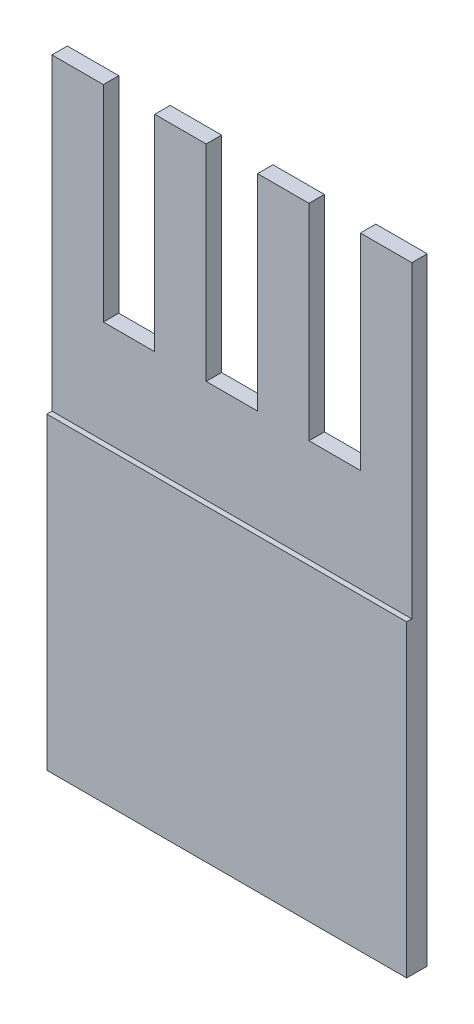
ISO-10303-21;
HEADER;
FILE_DESCRIPTION(('STEP AP214'),'2;1');
FILE_NAME('part.step','',(''),(''),'','','');
FILE_SCHEMA(('AUTOMOTIVE_DESIGN { 1 0 10303 214 1 1 1 1 }'));
ENDSEC;
DATA;
#1=APPLICATION_CONTEXT('core data for automotive mechanical design processes');
#2=APPLICATION_PROTOCOL_DEFINITION('international standard','automotive_design',2000,#1);
#3=PRODUCT_CONTEXT('',#1,'mechanical');
#4=PRODUCT('Part','Part','',(#3));
#5=PRODUCT_RELATED_PRODUCT_CATEGORY('part','',(#4));
#6=PRODUCT_DEFINITION_FORMATION('','',#4);
#7=PRODUCT_DEFINITION_CONTEXT('part definition',#1,'design');
#8=PRODUCT_DEFINITION('design','',#6,#7);
#9=PRODUCT_DEFINITION_SHAPE('','',#8);
#10=(LENGTH_UNIT() NAMED_UNIT(*) SI_UNIT(.MILLI.,.METRE.));
#11=(NAMED_UNIT(*) PLANE_ANGLE_UNIT() SI_UNIT($,.RADIAN.));
#12=(NAMED_UNIT(*) SI_UNIT($,.STERADIAN.) SOLID_ANGLE_UNIT());
#13=UNCERTAINTY_MEASURE_WITH_UNIT(LENGTH_MEASURE(1.E-05),#10,'distance_accuracy_value','');
#14=(GEOMETRIC_REPRESENTATION_CONTEXT(3) GLOBAL_UNCERTAINTY_ASSIGNED_CONTEXT((#13)) GLOBAL_UNIT_ASSIGNED_CONTEXT((#10,
#11,#12)) REPRESENTATION_CONTEXT('',''));
#15=CARTESIAN_POINT('',(0.,0.,0.));
#16=DIRECTION('',(0.,0.,1.));
#17=DIRECTION('',(1.,0.,0.));
#18=AXIS2_PLACEMENT_3D('',#15,#16,#17);
#19=CARTESIAN_POINT('',(0.,0.,2.));
#20=DIRECTION('',(0.,1.,0.));
#21=DIRECTION('',(0.,0.,1.));
#22=AXIS2_PLACEMENT_3D('',#19,#20,#21);
#23=PLANE('',#22);
#24=DIRECTION('',(1.,0.,0.));
#25=VECTOR('',#24,1.);
#26=CARTESIAN_POINT('',(0.,0.,1.5));
#27=LINE('',#26,#25);
#28=CARTESIAN_POINT('',(-17.5,0.,1.5));
#29=VERTEX_POINT('',#28);
#30=CARTESIAN_POINT('',(17.5,0.,1.5));
#31=VERTEX_POINT('',#30);
#32=EDGE_CURVE('E49',#29,#31,#27,.T.);
#33=ORIENTED_EDGE('',*,*,#32,.F.);
#34=DIRECTION('',(0.,0.,-1.));
#35=VECTOR('',#34,1.);
#36=CARTESIAN_POINT('',(-17.5,0.,2.));
#37=LINE('',#36,#35);
#38=CARTESIAN_POINT('',(-17.5,0.,2.));
#39=VERTEX_POINT('',#38);
#40=EDGE_CURVE('E11',#39,#29,#37,.T.);
#41=ORIENTED_EDGE('',*,*,#40,.F.);
#42=DIRECTION('',(1.,0.,0.));
#43=VECTOR('',#42,1.);
#44=CARTESIAN_POINT('',(0.,0.,2.));
#45=LINE('',#44,#43);
#46=CARTESIAN_POINT('',(17.5,0.,2.));
#47=VERTEX_POINT('',#46);
#48=EDGE_CURVE('E160',#39,#47,#45,.T.);
#49=ORIENTED_EDGE('',*,*,#48,.T.);
#50=DIRECTION('',(0.,0.,-1.));
#51=VECTOR('',#50,1.);
#52=CARTESIAN_POINT('',(17.5,0.,2.));
#53=LINE('',#52,#51);
#54=EDGE_CURVE('E56',#47,#31,#53,.T.);
#55=ORIENTED_EDGE('',*,*,#54,.T.);
#56=EDGE_LOOP('',(#33,#41,#49,#55));
#57=FACE_BOUND('',#56,.T.);
#58=ADVANCED_FACE('F35',(#57),#23,.T.);
#59=CARTESIAN_POINT('',(-17.5,0.,2.));
#60=DIRECTION('',(1.,0.,0.));
#61=DIRECTION('',(0.,0.,-1.));
#62=AXIS2_PLACEMENT_3D('',#59,#60,#61);
#63=PLANE('',#62);
#64=DIRECTION('',(0.,-1.,0.));
#65=VECTOR('',#64,1.);
#66=CARTESIAN_POINT('',(-17.5,0.,0.));
#67=LINE('',#66,#65);
#68=CARTESIAN_POINT('',(-17.5,30.,0.));
#69=VERTEX_POINT('',#68);
#70=CARTESIAN_POINT('',(-17.5,-30.,0.));
#71=VERTEX_POINT('',#70);
#72=EDGE_CURVE('E280',#69,#71,#67,.T.);
#73=ORIENTED_EDGE('',*,*,#72,.T.);
#74=DIRECTION('',(0.,0.,-1.));
#75=VECTOR('',#74,1.);
#76=CARTESIAN_POINT('',(-17.5,-30.,2.));
#77=LINE('',#76,#75);
#78=CARTESIAN_POINT('',(-17.5,-30.,2.));
#79=VERTEX_POINT('',#78);
#80=EDGE_CURVE('E42',#79,#71,#77,.T.);
#81=ORIENTED_EDGE('',*,*,#80,.F.);
#82=DIRECTION('',(0.,-1.,0.));
#83=VECTOR('',#82,1.);
#84=CARTESIAN_POINT('',(-17.5,0.,2.));
#85=LINE('',#84,#83);
#86=EDGE_CURVE('E282',#39,#79,#85,.T.);
#87=ORIENTED_EDGE('',*,*,#86,.F.);
#88=ORIENTED_EDGE('',*,*,#40,.T.);
#89=DIRECTION('',(0.,-1.,0.));
#90=VECTOR('',#89,1.);
#91=CARTESIAN_POINT('',(-17.5,0.,1.5));
#92=LINE('',#91,#90);
#93=CARTESIAN_POINT('',(-17.5,30.,1.5));
#94=VERTEX_POINT('',#93);
#95=EDGE_CURVE('E170',#94,#29,#92,.T.);
#96=ORIENTED_EDGE('',*,*,#95,.F.);
#97=DIRECTION('',(0.,0.,-1.));
#98=VECTOR('',#97,1.);
#99=CARTESIAN_POINT('',(-17.5,30.,1.5));
#100=LINE('',#99,#98);
#101=EDGE_CURVE('E213',#94,#69,#100,.T.);
#102=ORIENTED_EDGE('',*,*,#101,.T.);
#103=EDGE_LOOP('',(#73,#81,#87,#88,#96,#102));
#104=FACE_BOUND('',#103,.T.);
#105=ADVANCED_FACE('F301',(#104),#63,.F.);
#106=CARTESIAN_POINT('',(0.,-30.,2.));
#107=DIRECTION('',(0.,-1.,0.));
#108=DIRECTION('',(0.,0.,-1.));
#109=AXIS2_PLACEMENT_3D('',#106,#107,#108);
#110=PLANE('',#109);
#111=DIRECTION('',(-1.,0.,0.));
#112=VECTOR('',#111,1.);
#113=CARTESIAN_POINT('',(0.,-30.,0.));
#114=LINE('',#113,#112);
#115=CARTESIAN_POINT('',(17.5,-30.,0.));
#116=VERTEX_POINT('',#115);
#117=EDGE_CURVE('E291',#116,#71,#114,.T.);
#118=ORIENTED_EDGE('',*,*,#117,.F.);
#119=DIRECTION('',(0.,0.,-1.));
#120=VECTOR('',#119,1.);
#121=CARTESIAN_POINT('',(17.5,-30.,2.));
#122=LINE('',#121,#120);
#123=CARTESIAN_POINT('',(17.5,-30.,2.));
#124=VERTEX_POINT('',#123);
#125=EDGE_CURVE('E70',#124,#116,#122,.T.);
#126=ORIENTED_EDGE('',*,*,#125,.F.);
#127=DIRECTION('',(-1.,0.,0.));
#128=VECTOR('',#127,1.);
#129=CARTESIAN_POINT('',(0.,-30.,2.));
#130=LINE('',#129,#128);
#131=EDGE_CURVE('E285',#124,#79,#130,.T.);
#132=ORIENTED_EDGE('',*,*,#131,.T.);
#133=ORIENTED_EDGE('',*,*,#80,.T.);
#134=EDGE_LOOP('',(#118,#126,#132,#133));
#135=FACE_BOUND('',#134,.T.);
#136=ADVANCED_FACE('F298',(#135),#110,.T.);
#137=CARTESIAN_POINT('',(17.5,0.,2.));
#138=DIRECTION('',(1.,0.,0.));
#139=DIRECTION('',(0.,0.,-1.));
#140=AXIS2_PLACEMENT_3D('',#137,#138,#139);
#141=PLANE('',#140);
#142=DIRECTION('',(0.,-1.,0.));
#143=VECTOR('',#142,1.);
#144=CARTESIAN_POINT('',(17.5,0.,0.));
#145=LINE('',#144,#143);
#146=CARTESIAN_POINT('',(17.5,30.,0.));
#147=VERTEX_POINT('',#146);
#148=EDGE_CURVE('E283',#147,#116,#145,.T.);
#149=ORIENTED_EDGE('',*,*,#148,.F.);
#150=DIRECTION('',(0.,0.,-1.));
#151=VECTOR('',#150,1.);
#152=CARTESIAN_POINT('',(17.5,30.,1.5));
#153=LINE('',#152,#151);
#154=CARTESIAN_POINT('',(17.5,30.,1.5));
#155=VERTEX_POINT('',#154);
#156=EDGE_CURVE('E174',#155,#147,#153,.T.);
#157=ORIENTED_EDGE('',*,*,#156,.F.);
#158=DIRECTION('',(0.,-1.,0.));
#159=VECTOR('',#158,1.);
#160=CARTESIAN_POINT('',(17.5,0.,1.5));
#161=LINE('',#160,#159);
#162=EDGE_CURVE('E168',#155,#31,#161,.T.);
#163=ORIENTED_EDGE('',*,*,#162,.T.);
#164=ORIENTED_EDGE('',*,*,#54,.F.);
#165=DIRECTION('',(0.,-1.,0.));
#166=VECTOR('',#165,1.);
#167=CARTESIAN_POINT('',(17.5,0.,2.));
#168=LINE('',#167,#166);
#169=EDGE_CURVE('E162',#47,#124,#168,.T.);
#170=ORIENTED_EDGE('',*,*,#169,.T.);
#171=ORIENTED_EDGE('',*,*,#125,.T.);
#172=EDGE_LOOP('',(#149,#157,#163,#164,#170,#171));
#173=FACE_BOUND('',#172,.T.);
#174=ADVANCED_FACE('F172',(#173),#141,.T.);
#175=CARTESIAN_POINT('',(0.,0.,2.));
#176=DIRECTION('',(0.,0.,1.));
#177=DIRECTION('',(1.,0.,0.));
#178=AXIS2_PLACEMENT_3D('',#175,#176,#177);
#179=PLANE('',#178);
#180=ORIENTED_EDGE('',*,*,#48,.F.);
#181=ORIENTED_EDGE('',*,*,#86,.T.);
#182=ORIENTED_EDGE('',*,*,#131,.F.);
#183=ORIENTED_EDGE('',*,*,#169,.F.);
#184=EDGE_LOOP('',(#180,#181,#182,#183));
#185=FACE_BOUND('',#184,.T.);
#186=ADVANCED_FACE('F360',(#185),#179,.T.);
#187=CARTESIAN_POINT('',(0.,0.,0.));
#188=DIRECTION('',(0.,0.,1.));
#189=DIRECTION('',(1.,0.,0.));
#190=AXIS2_PLACEMENT_3D('',#187,#188,#189);
#191=PLANE('',#190);
#192=ORIENTED_EDGE('',*,*,#72,.F.);
#193=DIRECTION('',(-1.,0.,0.));
#194=VECTOR('',#193,1.);
#195=CARTESIAN_POINT('',(0.,30.,0.));
#196=LINE('',#195,#194);
#197=CARTESIAN_POINT('',(-12.5,30.,0.));
#198=VERTEX_POINT('',#197);
#199=EDGE_CURVE('E249',#198,#69,#196,.T.);
#200=ORIENTED_EDGE('',*,*,#199,.F.);
#201=DIRECTION('',(0.,-1.,0.));
#202=VECTOR('',#201,1.);
#203=CARTESIAN_POINT('',(-12.5,0.,0.));
#204=LINE('',#203,#202);
#205=CARTESIAN_POINT('',(-12.5,10.,0.));
#206=VERTEX_POINT('',#205);
#207=EDGE_CURVE('E246',#198,#206,#204,.T.);
#208=ORIENTED_EDGE('',*,*,#207,.T.);
#209=DIRECTION('',(1.,0.,0.));
#210=VECTOR('',#209,1.);
#211=CARTESIAN_POINT('',(0.,10.,0.));
#212=LINE('',#211,#210);
#213=CARTESIAN_POINT('',(-7.5,10.,0.));
#214=VERTEX_POINT('',#213);
#215=EDGE_CURVE('E243',#206,#214,#212,.T.);
#216=ORIENTED_EDGE('',*,*,#215,.T.);
#217=DIRECTION('',(0.,-1.,0.));
#218=VECTOR('',#217,1.);
#219=CARTESIAN_POINT('',(-7.5,0.,0.));
#220=LINE('',#219,#218);
#221=CARTESIAN_POINT('',(-7.5,30.,0.));
#222=VERTEX_POINT('',#221);
#223=EDGE_CURVE('E240',#222,#214,#220,.T.);
#224=ORIENTED_EDGE('',*,*,#223,.F.);
#225=DIRECTION('',(1.,0.,0.));
#226=VECTOR('',#225,1.);
#227=CARTESIAN_POINT('',(0.,30.,0.));
#228=LINE('',#227,#226);
#229=CARTESIAN_POINT('',(-2.5,30.,0.));
#230=VERTEX_POINT('',#229);
#231=EDGE_CURVE('E237',#222,#230,#228,.T.);
#232=ORIENTED_EDGE('',*,*,#231,.T.);
#233=DIRECTION('',(0.,-1.,0.));
#234=VECTOR('',#233,1.);
#235=CARTESIAN_POINT('',(-2.5,0.,0.));
#236=LINE('',#235,#234);
#237=CARTESIAN_POINT('',(-2.5,10.,0.));
#238=VERTEX_POINT('',#237);
#239=EDGE_CURVE('E234',#230,#238,#236,.T.);
#240=ORIENTED_EDGE('',*,*,#239,.T.);
#241=DIRECTION('',(1.,0.,0.));
#242=VECTOR('',#241,1.);
#243=CARTESIAN_POINT('',(0.,10.,0.));
#244=LINE('',#243,#242);
#245=CARTESIAN_POINT('',(2.5,10.,0.));
#246=VERTEX_POINT('',#245);
#247=EDGE_CURVE('E231',#238,#246,#244,.T.);
#248=ORIENTED_EDGE('',*,*,#247,.T.);
#249=DIRECTION('',(0.,-1.,0.));
#250=VECTOR('',#249,1.);
#251=CARTESIAN_POINT('',(2.5,0.,0.));
#252=LINE('',#251,#250);
#253=CARTESIAN_POINT('',(2.5,30.,0.));
#254=VERTEX_POINT('',#253);
#255=EDGE_CURVE('E228',#254,#246,#252,.T.);
#256=ORIENTED_EDGE('',*,*,#255,.F.);
#257=DIRECTION('',(1.,0.,0.));
#258=VECTOR('',#257,1.);
#259=CARTESIAN_POINT('',(0.,30.,0.));
#260=LINE('',#259,#258);
#261=CARTESIAN_POINT('',(7.49999999999999,30.,0.));
#262=VERTEX_POINT('',#261);
#263=EDGE_CURVE('E225',#254,#262,#260,.T.);
#264=ORIENTED_EDGE('',*,*,#263,.T.);
#265=DIRECTION('',(0.,-1.,0.));
#266=VECTOR('',#265,1.);
#267=CARTESIAN_POINT('',(7.49999999999999,0.,0.));
#268=LINE('',#267,#266);
#269=CARTESIAN_POINT('',(7.49999999999999,10.,0.));
#270=VERTEX_POINT('',#269);
#271=EDGE_CURVE('E222',#262,#270,#268,.T.);
#272=ORIENTED_EDGE('',*,*,#271,.T.);
#273=DIRECTION('',(1.,0.,0.));
#274=VECTOR('',#273,1.);
#275=CARTESIAN_POINT('',(0.,10.,0.));
#276=LINE('',#275,#274);
#277=CARTESIAN_POINT('',(12.5,10.,0.));
#278=VERTEX_POINT('',#277);
#279=EDGE_CURVE('E219',#270,#278,#276,.T.);
#280=ORIENTED_EDGE('',*,*,#279,.T.);
#281=DIRECTION('',(0.,-1.,0.));
#282=VECTOR('',#281,1.);
#283=CARTESIAN_POINT('',(12.5,0.,0.));
#284=LINE('',#283,#282);
#285=CARTESIAN_POINT('',(12.5,30.,0.));
#286=VERTEX_POINT('',#285);
#287=EDGE_CURVE('E216',#286,#278,#284,.T.);
#288=ORIENTED_EDGE('',*,*,#287,.F.);
#289=DIRECTION('',(-1.,0.,0.));
#290=VECTOR('',#289,1.);
#291=CARTESIAN_POINT('',(0.,30.,0.));
#292=LINE('',#291,#290);
#293=EDGE_CURVE('E214',#147,#286,#292,.T.);
#294=ORIENTED_EDGE('',*,*,#293,.F.);
#295=ORIENTED_EDGE('',*,*,#148,.T.);
#296=ORIENTED_EDGE('',*,*,#117,.T.);
#297=EDGE_LOOP('',(#192,#200,#208,#216,#224,#232,#240,#248,#256,#264,#272,#280,#288,#294,#295,#296));
#298=FACE_BOUND('',#297,.T.);
#299=ADVANCED_FACE('F305',(#298),#191,.F.);
#300=CARTESIAN_POINT('',(0.,30.,1.5));
#301=DIRECTION('',(0.,-1.,0.));
#302=DIRECTION('',(0.,0.,-1.));
#303=AXIS2_PLACEMENT_3D('',#300,#301,#302);
#304=PLANE('',#303);
#305=ORIENTED_EDGE('',*,*,#293,.T.);
#306=DIRECTION('',(0.,0.,-1.));
#307=VECTOR('',#306,1.);
#308=CARTESIAN_POINT('',(12.5,30.,1.5));
#309=LINE('',#308,#307);
#310=CARTESIAN_POINT('',(12.5,30.,1.5));
#311=VERTEX_POINT('',#310);
#312=EDGE_CURVE('E276',#311,#286,#309,.T.);
#313=ORIENTED_EDGE('',*,*,#312,.F.);
#314=DIRECTION('',(-1.,0.,0.));
#315=VECTOR('',#314,1.);
#316=CARTESIAN_POINT('',(0.,30.,1.5));
#317=LINE('',#316,#315);
#318=EDGE_CURVE('E176',#155,#311,#317,.T.);
#319=ORIENTED_EDGE('',*,*,#318,.F.);
#320=ORIENTED_EDGE('',*,*,#156,.T.);
#321=EDGE_LOOP('',(#305,#313,#319,#320));
#322=FACE_BOUND('',#321,.T.);
#323=ADVANCED_FACE('F309',(#322),#304,.F.);
#324=CARTESIAN_POINT('',(12.5,0.,1.5));
#325=DIRECTION('',(1.,0.,0.));
#326=DIRECTION('',(0.,1.,0.));
#327=AXIS2_PLACEMENT_3D('',#324,#325,#326);
#328=PLANE('',#327);
#329=ORIENTED_EDGE('',*,*,#287,.T.);
#330=DIRECTION('',(0.,0.,-1.));
#331=VECTOR('',#330,1.);
#332=CARTESIAN_POINT('',(12.5,10.,1.5));
#333=LINE('',#332,#331);
#334=CARTESIAN_POINT('',(12.5,10.,1.5));
#335=VERTEX_POINT('',#334);
#336=EDGE_CURVE('E274',#335,#278,#333,.T.);
#337=ORIENTED_EDGE('',*,*,#336,.F.);
#338=DIRECTION('',(0.,-1.,0.));
#339=VECTOR('',#338,1.);
#340=CARTESIAN_POINT('',(12.5,0.,1.5));
#341=LINE('',#340,#339);
#342=EDGE_CURVE('E178',#311,#335,#341,.T.);
#343=ORIENTED_EDGE('',*,*,#342,.F.);
#344=ORIENTED_EDGE('',*,*,#312,.T.);
#345=EDGE_LOOP('',(#329,#337,#343,#344));
#346=FACE_BOUND('',#345,.T.);
#347=ADVANCED_FACE('F316',(#346),#328,.F.);
#348=CARTESIAN_POINT('',(0.,10.,1.5));
#349=DIRECTION('',(0.,1.,0.));
#350=DIRECTION('',(0.,0.,1.));
#351=AXIS2_PLACEMENT_3D('',#348,#349,#350);
#352=PLANE('',#351);
#353=ORIENTED_EDGE('',*,*,#279,.F.);
#354=DIRECTION('',(0.,0.,-1.));
#355=VECTOR('',#354,1.);
#356=CARTESIAN_POINT('',(7.49999999999999,10.,1.5));
#357=LINE('',#356,#355);
#358=CARTESIAN_POINT('',(7.49999999999999,10.,1.5));
#359=VERTEX_POINT('',#358);
#360=EDGE_CURVE('E272',#359,#270,#357,.T.);
#361=ORIENTED_EDGE('',*,*,#360,.F.);
#362=DIRECTION('',(1.,0.,0.));
#363=VECTOR('',#362,1.);
#364=CARTESIAN_POINT('',(0.,10.,1.5));
#365=LINE('',#364,#363);
#366=EDGE_CURVE('E183',#359,#335,#365,.T.);
#367=ORIENTED_EDGE('',*,*,#366,.T.);
#368=ORIENTED_EDGE('',*,*,#336,.T.);
#369=EDGE_LOOP('',(#353,#361,#367,#368));
#370=FACE_BOUND('',#369,.T.);
#371=ADVANCED_FACE('F319',(#370),#352,.T.);
#372=CARTESIAN_POINT('',(7.49999999999999,0.,1.5));
#373=DIRECTION('',(1.,0.,0.));
#374=DIRECTION('',(0.,0.,-1.));
#375=AXIS2_PLACEMENT_3D('',#372,#373,#374);
#376=PLANE('',#375);
#377=ORIENTED_EDGE('',*,*,#271,.F.);
#378=DIRECTION('',(0.,0.,-1.));
#379=VECTOR('',#378,1.);
#380=CARTESIAN_POINT('',(7.49999999999999,30.,1.5));
#381=LINE('',#380,#379);
#382=CARTESIAN_POINT('',(7.49999999999999,30.,1.5));
#383=VERTEX_POINT('',#382);
#384=EDGE_CURVE('E270',#383,#262,#381,.T.);
#385=ORIENTED_EDGE('',*,*,#384,.F.);
#386=DIRECTION('',(0.,-1.,0.));
#387=VECTOR('',#386,1.);
#388=CARTESIAN_POINT('',(7.49999999999999,0.,1.5));
#389=LINE('',#388,#387);
#390=EDGE_CURVE('E186',#383,#359,#389,.T.);
#391=ORIENTED_EDGE('',*,*,#390,.T.);
#392=ORIENTED_EDGE('',*,*,#360,.T.);
#393=EDGE_LOOP('',(#377,#385,#391,#392));
#394=FACE_BOUND('',#393,.T.);
#395=ADVANCED_FACE('F322',(#394),#376,.T.);
#396=CARTESIAN_POINT('',(0.,30.,1.5));
#397=DIRECTION('',(0.,1.,0.));
#398=DIRECTION('',(0.,0.,1.));
#399=AXIS2_PLACEMENT_3D('',#396,#397,#398);
#400=PLANE('',#399);
#401=ORIENTED_EDGE('',*,*,#263,.F.);
#402=DIRECTION('',(0.,0.,-1.));
#403=VECTOR('',#402,1.);
#404=CARTESIAN_POINT('',(2.5,30.,1.5));
#405=LINE('',#404,#403);
#406=CARTESIAN_POINT('',(2.5,30.,1.5));
#407=VERTEX_POINT('',#406);
#408=EDGE_CURVE('E268',#407,#254,#405,.T.);
#409=ORIENTED_EDGE('',*,*,#408,.F.);
#410=DIRECTION('',(1.,0.,0.));
#411=VECTOR('',#410,1.);
#412=CARTESIAN_POINT('',(0.,30.,1.5));
#413=LINE('',#412,#411);
#414=EDGE_CURVE('E189',#407,#383,#413,.T.);
#415=ORIENTED_EDGE('',*,*,#414,.T.);
#416=ORIENTED_EDGE('',*,*,#384,.T.);
#417=EDGE_LOOP('',(#401,#409,#415,#416));
#418=FACE_BOUND('',#417,.T.);
#419=ADVANCED_FACE('F326',(#418),#400,.T.);
#420=CARTESIAN_POINT('',(2.5,0.,1.5));
#421=DIRECTION('',(1.,0.,0.));
#422=DIRECTION('',(0.,1.,0.));
#423=AXIS2_PLACEMENT_3D('',#420,#421,#422);
#424=PLANE('',#423);
#425=ORIENTED_EDGE('',*,*,#255,.T.);
#426=DIRECTION('',(0.,0.,-1.));
#427=VECTOR('',#426,1.);
#428=CARTESIAN_POINT('',(2.5,10.,1.5));
#429=LINE('',#428,#427);
#430=CARTESIAN_POINT('',(2.5,10.,1.5));
#431=VERTEX_POINT('',#430);
#432=EDGE_CURVE('E266',#431,#246,#429,.T.);
#433=ORIENTED_EDGE('',*,*,#432,.F.);
#434=DIRECTION('',(0.,-1.,0.));
#435=VECTOR('',#434,1.);
#436=CARTESIAN_POINT('',(2.5,0.,1.5));
#437=LINE('',#436,#435);
#438=EDGE_CURVE('E192',#407,#431,#437,.T.);
#439=ORIENTED_EDGE('',*,*,#438,.F.);
#440=ORIENTED_EDGE('',*,*,#408,.T.);
#441=EDGE_LOOP('',(#425,#433,#439,#440));
#442=FACE_BOUND('',#441,.T.);
#443=ADVANCED_FACE('F331',(#442),#424,.F.);
#444=CARTESIAN_POINT('',(0.,10.,1.5));
#445=DIRECTION('',(0.,1.,0.));
#446=DIRECTION('',(0.,0.,1.));
#447=AXIS2_PLACEMENT_3D('',#444,#445,#446);
#448=PLANE('',#447);
#449=ORIENTED_EDGE('',*,*,#247,.F.);
#450=DIRECTION('',(0.,0.,-1.));
#451=VECTOR('',#450,1.);
#452=CARTESIAN_POINT('',(-2.5,10.,1.5));
#453=LINE('',#452,#451);
#454=CARTESIAN_POINT('',(-2.5,10.,1.5));
#455=VERTEX_POINT('',#454);
#456=EDGE_CURVE('E264',#455,#238,#453,.T.);
#457=ORIENTED_EDGE('',*,*,#456,.F.);
#458=DIRECTION('',(1.,0.,0.));
#459=VECTOR('',#458,1.);
#460=CARTESIAN_POINT('',(0.,10.,1.5));
#461=LINE('',#460,#459);
#462=EDGE_CURVE('E194',#455,#431,#461,.T.);
#463=ORIENTED_EDGE('',*,*,#462,.T.);
#464=ORIENTED_EDGE('',*,*,#432,.T.);
#465=EDGE_LOOP('',(#449,#457,#463,#464));
#466=FACE_BOUND('',#465,.T.);
#467=ADVANCED_FACE('F446',(#466),#448,.T.);
#468=CARTESIAN_POINT('',(-2.5,0.,1.5));
#469=DIRECTION('',(1.,0.,0.));
#470=DIRECTION('',(0.,1.,0.));
#471=AXIS2_PLACEMENT_3D('',#468,#469,#470);
#472=PLANE('',#471);
#473=ORIENTED_EDGE('',*,*,#239,.F.);
#474=DIRECTION('',(0.,0.,-1.));
#475=VECTOR('',#474,1.);
#476=CARTESIAN_POINT('',(-2.5,30.,1.5));
#477=LINE('',#476,#475);
#478=CARTESIAN_POINT('',(-2.5,30.,1.5));
#479=VERTEX_POINT('',#478);
#480=EDGE_CURVE('E262',#479,#230,#477,.T.);
#481=ORIENTED_EDGE('',*,*,#480,.F.);
#482=DIRECTION('',(0.,-1.,0.));
#483=VECTOR('',#482,1.);
#484=CARTESIAN_POINT('',(-2.5,0.,1.5));
#485=LINE('',#484,#483);
#486=EDGE_CURVE('E197',#479,#455,#485,.T.);
#487=ORIENTED_EDGE('',*,*,#486,.T.);
#488=ORIENTED_EDGE('',*,*,#456,.T.);
#489=EDGE_LOOP('',(#473,#481,#487,#488));
#490=FACE_BOUND('',#489,.T.);
#491=ADVANCED_FACE('F338',(#490),#472,.T.);
#492=CARTESIAN_POINT('',(0.,30.,1.5));
#493=DIRECTION('',(0.,1.,0.));
#494=DIRECTION('',(0.,0.,1.));
#495=AXIS2_PLACEMENT_3D('',#492,#493,#494);
#496=PLANE('',#495);
#497=ORIENTED_EDGE('',*,*,#231,.F.);
#498=DIRECTION('',(0.,0.,-1.));
#499=VECTOR('',#498,1.);
#500=CARTESIAN_POINT('',(-7.5,30.,1.5));
#501=LINE('',#500,#499);
#502=CARTESIAN_POINT('',(-7.5,30.,1.5));
#503=VERTEX_POINT('',#502);
#504=EDGE_CURVE('E260',#503,#222,#501,.T.);
#505=ORIENTED_EDGE('',*,*,#504,.F.);
#506=DIRECTION('',(1.,0.,0.));
#507=VECTOR('',#506,1.);
#508=CARTESIAN_POINT('',(0.,30.,1.5));
#509=LINE('',#508,#507);
#510=EDGE_CURVE('E200',#503,#479,#509,.T.);
#511=ORIENTED_EDGE('',*,*,#510,.T.);
#512=ORIENTED_EDGE('',*,*,#480,.T.);
#513=EDGE_LOOP('',(#497,#505,#511,#512));
#514=FACE_BOUND('',#513,.T.);
#515=ADVANCED_FACE('F342',(#514),#496,.T.);
#516=CARTESIAN_POINT('',(-7.5,0.,1.5));
#517=DIRECTION('',(1.,0.,0.));
#518=DIRECTION('',(0.,1.,0.));
#519=AXIS2_PLACEMENT_3D('',#516,#517,#518);
#520=PLANE('',#519);
#521=ORIENTED_EDGE('',*,*,#223,.T.);
#522=DIRECTION('',(0.,0.,-1.));
#523=VECTOR('',#522,1.);
#524=CARTESIAN_POINT('',(-7.5,10.,1.5));
#525=LINE('',#524,#523);
#526=CARTESIAN_POINT('',(-7.5,10.,1.5));
#527=VERTEX_POINT('',#526);
#528=EDGE_CURVE('E258',#527,#214,#525,.T.);
#529=ORIENTED_EDGE('',*,*,#528,.F.);
#530=DIRECTION('',(0.,-1.,0.));
#531=VECTOR('',#530,1.);
#532=CARTESIAN_POINT('',(-7.5,0.,1.5));
#533=LINE('',#532,#531);
#534=EDGE_CURVE('E203',#503,#527,#533,.T.);
#535=ORIENTED_EDGE('',*,*,#534,.F.);
#536=ORIENTED_EDGE('',*,*,#504,.T.);
#537=EDGE_LOOP('',(#521,#529,#535,#536));
#538=FACE_BOUND('',#537,.T.);
#539=ADVANCED_FACE('F348',(#538),#520,.F.);
#540=CARTESIAN_POINT('',(0.,10.,1.5));
#541=DIRECTION('',(0.,1.,0.));
#542=DIRECTION('',(0.,0.,1.));
#543=AXIS2_PLACEMENT_3D('',#540,#541,#542);
#544=PLANE('',#543);
#545=ORIENTED_EDGE('',*,*,#215,.F.);
#546=DIRECTION('',(0.,0.,-1.));
#547=VECTOR('',#546,1.);
#548=CARTESIAN_POINT('',(-12.5,10.,1.5));
#549=LINE('',#548,#547);
#550=CARTESIAN_POINT('',(-12.5,10.,1.5));
#551=VERTEX_POINT('',#550);
#552=EDGE_CURVE('E256',#551,#206,#549,.T.);
#553=ORIENTED_EDGE('',*,*,#552,.F.);
#554=DIRECTION('',(1.,0.,0.));
#555=VECTOR('',#554,1.);
#556=CARTESIAN_POINT('',(0.,10.,1.5));
#557=LINE('',#556,#555);
#558=EDGE_CURVE('E205',#551,#527,#557,.T.);
#559=ORIENTED_EDGE('',*,*,#558,.T.);
#560=ORIENTED_EDGE('',*,*,#528,.T.);
#561=EDGE_LOOP('',(#545,#553,#559,#560));
#562=FACE_BOUND('',#561,.T.);
#563=ADVANCED_FACE('F352',(#562),#544,.T.);
#564=CARTESIAN_POINT('',(-12.5,0.,1.5));
#565=DIRECTION('',(1.,0.,0.));
#566=DIRECTION('',(0.,1.,0.));
#567=AXIS2_PLACEMENT_3D('',#564,#565,#566);
#568=PLANE('',#567);
#569=ORIENTED_EDGE('',*,*,#207,.F.);
#570=DIRECTION('',(0.,0.,-1.));
#571=VECTOR('',#570,1.);
#572=CARTESIAN_POINT('',(-12.5,30.,1.5));
#573=LINE('',#572,#571);
#574=CARTESIAN_POINT('',(-12.5,30.,1.5));
#575=VERTEX_POINT('',#574);
#576=EDGE_CURVE('E254',#575,#198,#573,.T.);
#577=ORIENTED_EDGE('',*,*,#576,.F.);
#578=DIRECTION('',(0.,-1.,0.));
#579=VECTOR('',#578,1.);
#580=CARTESIAN_POINT('',(-12.5,0.,1.5));
#581=LINE('',#580,#579);
#582=EDGE_CURVE('E208',#575,#551,#581,.T.);
#583=ORIENTED_EDGE('',*,*,#582,.T.);
#584=ORIENTED_EDGE('',*,*,#552,.T.);
#585=EDGE_LOOP('',(#569,#577,#583,#584));
#586=FACE_BOUND('',#585,.T.);
#587=ADVANCED_FACE('F355',(#586),#568,.T.);
#588=CARTESIAN_POINT('',(0.,30.,1.5));
#589=DIRECTION('',(0.,-1.,0.));
#590=DIRECTION('',(0.,0.,-1.));
#591=AXIS2_PLACEMENT_3D('',#588,#589,#590);
#592=PLANE('',#591);
#593=ORIENTED_EDGE('',*,*,#199,.T.);
#594=ORIENTED_EDGE('',*,*,#101,.F.);
#595=DIRECTION('',(-1.,0.,0.));
#596=VECTOR('',#595,1.);
#597=CARTESIAN_POINT('',(0.,30.,1.5));
#598=LINE('',#597,#596);
#599=EDGE_CURVE('E211',#575,#94,#598,.T.);
#600=ORIENTED_EDGE('',*,*,#599,.F.);
#601=ORIENTED_EDGE('',*,*,#576,.T.);
#602=EDGE_LOOP('',(#593,#594,#600,#601));
#603=FACE_BOUND('',#602,.T.);
#604=ADVANCED_FACE('F358',(#603),#592,.F.);
#605=CARTESIAN_POINT('',(0.,0.,1.5));
#606=DIRECTION('',(0.,0.,1.));
#607=DIRECTION('',(1.,0.,0.));
#608=AXIS2_PLACEMENT_3D('',#605,#606,#607);
#609=PLANE('',#608);
#610=ORIENTED_EDGE('',*,*,#95,.T.);
#611=ORIENTED_EDGE('',*,*,#32,.T.);
#612=ORIENTED_EDGE('',*,*,#162,.F.);
#613=ORIENTED_EDGE('',*,*,#318,.T.);
#614=ORIENTED_EDGE('',*,*,#342,.T.);
#615=ORIENTED_EDGE('',*,*,#366,.F.);
#616=ORIENTED_EDGE('',*,*,#390,.F.);
#617=ORIENTED_EDGE('',*,*,#414,.F.);
#618=ORIENTED_EDGE('',*,*,#438,.T.);
#619=ORIENTED_EDGE('',*,*,#462,.F.);
#620=ORIENTED_EDGE('',*,*,#486,.F.);
#621=ORIENTED_EDGE('',*,*,#510,.F.);
#622=ORIENTED_EDGE('',*,*,#534,.T.);
#623=ORIENTED_EDGE('',*,*,#558,.F.);
#624=ORIENTED_EDGE('',*,*,#582,.F.);
#625=ORIENTED_EDGE('',*,*,#599,.T.);
#626=EDGE_LOOP('',(#610,#611,#612,#613,#614,#615,#616,#617,#618,#619,#620,#621,#622,#623,#624,#625));
#627=FACE_BOUND('',#626,.T.);
#628=ADVANCED_FACE('F167',(#627),#609,.T.);
#629=CLOSED_SHELL('',(#58,#105,#136,#174,#186,#299,#323,#347,#371,#395,#419,#443,#467,#491,#515,
#539,#563,#587,#604,#628));
#630=MANIFOLD_SOLID_BREP('B2',#629);
#631=ADVANCED_BREP_SHAPE_REPRESENTATION('',(#18,#630),#14);
#632=SHAPE_DEFINITION_REPRESENTATION(#9,#631);
ENDSEC;
END-ISO-10303-21;
